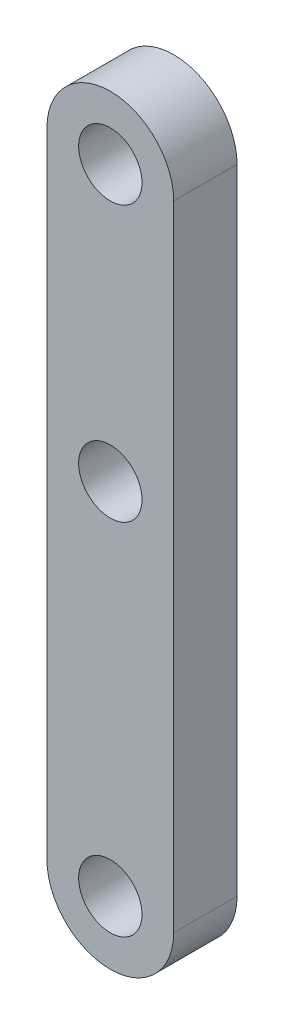
ISO-10303-21;
HEADER;
FILE_DESCRIPTION(('STEP AP214'),'2;1');
FILE_NAME('part.step','',(''),(''),'','','');
FILE_SCHEMA(('AUTOMOTIVE_DESIGN { 1 0 10303 214 1 1 1 1 }'));
ENDSEC;
DATA;
#1=APPLICATION_CONTEXT('core data for automotive mechanical design processes');
#2=APPLICATION_PROTOCOL_DEFINITION('international standard','automotive_design',2000,#1);
#3=PRODUCT_CONTEXT('',#1,'mechanical');
#4=PRODUCT('Part','Part','',(#3));
#5=PRODUCT_RELATED_PRODUCT_CATEGORY('part','',(#4));
#6=PRODUCT_DEFINITION_FORMATION('','',#4);
#7=PRODUCT_DEFINITION_CONTEXT('part definition',#1,'design');
#8=PRODUCT_DEFINITION('design','',#6,#7);
#9=PRODUCT_DEFINITION_SHAPE('','',#8);
#10=(LENGTH_UNIT() NAMED_UNIT(*) SI_UNIT(.MILLI.,.METRE.));
#11=(NAMED_UNIT(*) PLANE_ANGLE_UNIT() SI_UNIT($,.RADIAN.));
#12=(NAMED_UNIT(*) SI_UNIT($,.STERADIAN.) SOLID_ANGLE_UNIT());
#13=UNCERTAINTY_MEASURE_WITH_UNIT(LENGTH_MEASURE(1.E-05),#10,'distance_accuracy_value','');
#14=(GEOMETRIC_REPRESENTATION_CONTEXT(3) GLOBAL_UNCERTAINTY_ASSIGNED_CONTEXT((#13)) GLOBAL_UNIT_ASSIGNED_CONTEXT((#10,
#11,#12)) REPRESENTATION_CONTEXT('',''));
#15=CARTESIAN_POINT('',(0.,0.,0.));
#16=DIRECTION('',(0.,0.,1.));
#17=DIRECTION('',(1.,0.,0.));
#18=AXIS2_PLACEMENT_3D('',#15,#16,#17);
#19=CARTESIAN_POINT('',(0.,0.,3.));
#20=DIRECTION('',(0.,0.,1.));
#21=DIRECTION('',(1.,0.,0.));
#22=AXIS2_PLACEMENT_3D('',#19,#20,#21);
#23=PLANE('',#22);
#24=CARTESIAN_POINT('',(0.,-30.,3.));
#25=DIRECTION('',(0.,0.,1.));
#26=DIRECTION('',(-1.,0.,0.));
#27=AXIS2_PLACEMENT_3D('',#24,#25,#26);
#28=CIRCLE('',#27,1.5);
#29=CARTESIAN_POINT('',(-1.5,-30.,3.));
#30=VERTEX_POINT('',#29);
#31=EDGE_CURVE('E114',#30,#30,#28,.T.);
#32=ORIENTED_EDGE('',*,*,#31,.F.);
#33=EDGE_LOOP('',(#32));
#34=FACE_BOUND('',#33,.T.);
#35=CARTESIAN_POINT('',(0.,0.,3.));
#36=DIRECTION('',(0.,0.,1.));
#37=DIRECTION('',(1.,0.,0.));
#38=AXIS2_PLACEMENT_3D('',#35,#36,#37);
#39=CIRCLE('',#38,3.);
#40=CARTESIAN_POINT('',(3.,0.,3.));
#41=VERTEX_POINT('',#40);
#42=CARTESIAN_POINT('',(-3.,0.,3.));
#43=VERTEX_POINT('',#42);
#44=EDGE_CURVE('E84',#41,#43,#39,.T.);
#45=ORIENTED_EDGE('',*,*,#44,.T.);
#46=DIRECTION('',(0.,-1.,0.));
#47=VECTOR('',#46,1.);
#48=CARTESIAN_POINT('',(-3.,0.,3.));
#49=LINE('',#48,#47);
#50=CARTESIAN_POINT('',(-3.,-30.,3.));
#51=VERTEX_POINT('',#50);
#52=EDGE_CURVE('E79',#43,#51,#49,.T.);
#53=ORIENTED_EDGE('',*,*,#52,.T.);
#54=CARTESIAN_POINT('',(0.,-30.,3.));
#55=DIRECTION('',(0.,0.,1.));
#56=DIRECTION('',(-1.,0.,0.));
#57=AXIS2_PLACEMENT_3D('',#54,#55,#56);
#58=CIRCLE('',#57,3.);
#59=CARTESIAN_POINT('',(3.,-30.,3.));
#60=VERTEX_POINT('',#59);
#61=EDGE_CURVE('E82',#51,#60,#58,.T.);
#62=ORIENTED_EDGE('',*,*,#61,.T.);
#63=DIRECTION('',(0.,1.,0.));
#64=VECTOR('',#63,1.);
#65=CARTESIAN_POINT('',(3.,0.,3.));
#66=LINE('',#65,#64);
#67=EDGE_CURVE('E49',#60,#41,#66,.T.);
#68=ORIENTED_EDGE('',*,*,#67,.T.);
#69=EDGE_LOOP('',(#45,#53,#62,#68));
#70=FACE_BOUND('',#69,.T.);
#71=CARTESIAN_POINT('',(0.,0.,3.));
#72=DIRECTION('',(0.,0.,1.));
#73=DIRECTION('',(1.,0.,0.));
#74=AXIS2_PLACEMENT_3D('',#71,#72,#73);
#75=CIRCLE('',#74,1.5);
#76=CARTESIAN_POINT('',(1.5,0.,3.));
#77=VERTEX_POINT('',#76);
#78=EDGE_CURVE('E99',#77,#77,#75,.T.);
#79=ORIENTED_EDGE('',*,*,#78,.F.);
#80=EDGE_LOOP('',(#79));
#81=FACE_BOUND('',#80,.T.);
#82=CARTESIAN_POINT('',(0.,-13.,3.));
#83=DIRECTION('',(0.,0.,1.));
#84=DIRECTION('',(1.,0.,0.));
#85=AXIS2_PLACEMENT_3D('',#82,#83,#84);
#86=CIRCLE('',#85,1.5);
#87=CARTESIAN_POINT('',(1.5,-13.,3.));
#88=VERTEX_POINT('',#87);
#89=EDGE_CURVE('E120',#88,#88,#86,.T.);
#90=ORIENTED_EDGE('',*,*,#89,.F.);
#91=EDGE_LOOP('',(#90));
#92=FACE_BOUND('',#91,.T.);
#93=ADVANCED_FACE('F32',(#34,#70,#81,#92),#23,.T.);
#94=CARTESIAN_POINT('',(0.,0.,0.));
#95=DIRECTION('',(0.,0.,1.));
#96=DIRECTION('',(1.,0.,0.));
#97=AXIS2_PLACEMENT_3D('',#94,#95,#96);
#98=PLANE('',#97);
#99=CARTESIAN_POINT('',(0.,0.,0.));
#100=DIRECTION('',(0.,0.,1.));
#101=DIRECTION('',(1.,0.,0.));
#102=AXIS2_PLACEMENT_3D('',#99,#100,#101);
#103=CIRCLE('',#102,3.);
#104=CARTESIAN_POINT('',(3.,0.,0.));
#105=VERTEX_POINT('',#104);
#106=CARTESIAN_POINT('',(-3.,0.,0.));
#107=VERTEX_POINT('',#106);
#108=EDGE_CURVE('E96',#105,#107,#103,.T.);
#109=ORIENTED_EDGE('',*,*,#108,.F.);
#110=DIRECTION('',(0.,1.,0.));
#111=VECTOR('',#110,1.);
#112=CARTESIAN_POINT('',(3.,0.,0.));
#113=LINE('',#112,#111);
#114=CARTESIAN_POINT('',(3.,-30.,0.));
#115=VERTEX_POINT('',#114);
#116=EDGE_CURVE('E72',#115,#105,#113,.T.);
#117=ORIENTED_EDGE('',*,*,#116,.F.);
#118=CARTESIAN_POINT('',(0.,-30.,0.));
#119=DIRECTION('',(0.,0.,1.));
#120=DIRECTION('',(-1.,0.,0.));
#121=AXIS2_PLACEMENT_3D('',#118,#119,#120);
#122=CIRCLE('',#121,3.);
#123=CARTESIAN_POINT('',(-3.,-30.,0.));
#124=VERTEX_POINT('',#123);
#125=EDGE_CURVE('E66',#124,#115,#122,.T.);
#126=ORIENTED_EDGE('',*,*,#125,.F.);
#127=DIRECTION('',(0.,-1.,0.));
#128=VECTOR('',#127,1.);
#129=CARTESIAN_POINT('',(-3.,0.,0.));
#130=LINE('',#129,#128);
#131=EDGE_CURVE('E88',#107,#124,#130,.T.);
#132=ORIENTED_EDGE('',*,*,#131,.F.);
#133=EDGE_LOOP('',(#109,#117,#126,#132));
#134=FACE_BOUND('',#133,.T.);
#135=CARTESIAN_POINT('',(0.,0.,0.));
#136=DIRECTION('',(0.,0.,1.));
#137=DIRECTION('',(1.,0.,0.));
#138=AXIS2_PLACEMENT_3D('',#135,#136,#137);
#139=CIRCLE('',#138,1.5);
#140=CARTESIAN_POINT('',(1.5,0.,0.));
#141=VERTEX_POINT('',#140);
#142=EDGE_CURVE('E111',#141,#141,#139,.T.);
#143=ORIENTED_EDGE('',*,*,#142,.T.);
#144=EDGE_LOOP('',(#143));
#145=FACE_BOUND('',#144,.T.);
#146=CARTESIAN_POINT('',(0.,-30.,0.));
#147=DIRECTION('',(0.,0.,1.));
#148=DIRECTION('',(-1.,0.,0.));
#149=AXIS2_PLACEMENT_3D('',#146,#147,#148);
#150=CIRCLE('',#149,1.5);
#151=CARTESIAN_POINT('',(-1.5,-30.,0.));
#152=VERTEX_POINT('',#151);
#153=EDGE_CURVE('E117',#152,#152,#150,.T.);
#154=ORIENTED_EDGE('',*,*,#153,.T.);
#155=EDGE_LOOP('',(#154));
#156=FACE_BOUND('',#155,.T.);
#157=CARTESIAN_POINT('',(0.,-13.,0.));
#158=DIRECTION('',(0.,0.,1.));
#159=DIRECTION('',(1.,0.,0.));
#160=AXIS2_PLACEMENT_3D('',#157,#158,#159);
#161=CIRCLE('',#160,1.5);
#162=CARTESIAN_POINT('',(1.5,-13.,0.));
#163=VERTEX_POINT('',#162);
#164=EDGE_CURVE('E123',#163,#163,#161,.T.);
#165=ORIENTED_EDGE('',*,*,#164,.T.);
#166=EDGE_LOOP('',(#165));
#167=FACE_BOUND('',#166,.T.);
#168=ADVANCED_FACE('F107',(#134,#145,#156,#167),#98,.F.);
#169=CARTESIAN_POINT('',(0.,0.,3.));
#170=DIRECTION('',(0.,0.,-1.));
#171=DIRECTION('',(-1.,0.,0.));
#172=AXIS2_PLACEMENT_3D('',#169,#170,#171);
#173=CYLINDRICAL_SURFACE('',#172,3.);
#174=ORIENTED_EDGE('',*,*,#108,.T.);
#175=DIRECTION('',(0.,0.,-1.));
#176=VECTOR('',#175,1.);
#177=CARTESIAN_POINT('',(-3.,0.,3.));
#178=LINE('',#177,#176);
#179=EDGE_CURVE('E11',#43,#107,#178,.T.);
#180=ORIENTED_EDGE('',*,*,#179,.F.);
#181=ORIENTED_EDGE('',*,*,#44,.F.);
#182=DIRECTION('',(0.,0.,-1.));
#183=VECTOR('',#182,1.);
#184=CARTESIAN_POINT('',(3.,0.,3.));
#185=LINE('',#184,#183);
#186=EDGE_CURVE('E92',#41,#105,#185,.T.);
#187=ORIENTED_EDGE('',*,*,#186,.T.);
#188=EDGE_LOOP('',(#174,#180,#181,#187));
#189=FACE_BOUND('',#188,.T.);
#190=ADVANCED_FACE('F34',(#189),#173,.T.);
#191=CARTESIAN_POINT('',(-3.,0.,3.));
#192=DIRECTION('',(1.,0.,0.));
#193=DIRECTION('',(0.,1.,0.));
#194=AXIS2_PLACEMENT_3D('',#191,#192,#193);
#195=PLANE('',#194);
#196=ORIENTED_EDGE('',*,*,#131,.T.);
#197=DIRECTION('',(0.,0.,-1.));
#198=VECTOR('',#197,1.);
#199=CARTESIAN_POINT('',(-3.,-30.,3.));
#200=LINE('',#199,#198);
#201=EDGE_CURVE('E41',#51,#124,#200,.T.);
#202=ORIENTED_EDGE('',*,*,#201,.F.);
#203=ORIENTED_EDGE('',*,*,#52,.F.);
#204=ORIENTED_EDGE('',*,*,#179,.T.);
#205=EDGE_LOOP('',(#196,#202,#203,#204));
#206=FACE_BOUND('',#205,.T.);
#207=ADVANCED_FACE('F87',(#206),#195,.F.);
#208=CARTESIAN_POINT('',(0.,-30.,3.));
#209=DIRECTION('',(0.,0.,-1.));
#210=DIRECTION('',(-1.,0.,0.));
#211=AXIS2_PLACEMENT_3D('',#208,#209,#210);
#212=CYLINDRICAL_SURFACE('',#211,3.);
#213=ORIENTED_EDGE('',*,*,#125,.T.);
#214=DIRECTION('',(0.,0.,-1.));
#215=VECTOR('',#214,1.);
#216=CARTESIAN_POINT('',(3.,-30.,3.));
#217=LINE('',#216,#215);
#218=EDGE_CURVE('E89',#60,#115,#217,.T.);
#219=ORIENTED_EDGE('',*,*,#218,.F.);
#220=ORIENTED_EDGE('',*,*,#61,.F.);
#221=ORIENTED_EDGE('',*,*,#201,.T.);
#222=EDGE_LOOP('',(#213,#219,#220,#221));
#223=FACE_BOUND('',#222,.T.);
#224=ADVANCED_FACE('F90',(#223),#212,.T.);
#225=CARTESIAN_POINT('',(3.,0.,3.));
#226=DIRECTION('',(-1.,0.,0.));
#227=DIRECTION('',(0.,-1.,0.));
#228=AXIS2_PLACEMENT_3D('',#225,#226,#227);
#229=PLANE('',#228);
#230=ORIENTED_EDGE('',*,*,#116,.T.);
#231=ORIENTED_EDGE('',*,*,#186,.F.);
#232=ORIENTED_EDGE('',*,*,#67,.F.);
#233=ORIENTED_EDGE('',*,*,#218,.T.);
#234=EDGE_LOOP('',(#230,#231,#232,#233));
#235=FACE_BOUND('',#234,.T.);
#236=ADVANCED_FACE('F104',(#235),#229,.F.);
#237=CARTESIAN_POINT('',(0.,0.,3.));
#238=DIRECTION('',(0.,0.,-1.));
#239=DIRECTION('',(-1.,0.,0.));
#240=AXIS2_PLACEMENT_3D('',#237,#238,#239);
#241=CYLINDRICAL_SURFACE('',#240,1.5);
#242=ORIENTED_EDGE('',*,*,#78,.T.);
#243=EDGE_LOOP('',(#242));
#244=FACE_BOUND('',#243,.T.);
#245=ORIENTED_EDGE('',*,*,#142,.F.);
#246=EDGE_LOOP('',(#245));
#247=FACE_BOUND('',#246,.T.);
#248=ADVANCED_FACE('F141',(#244,#247),#241,.F.);
#249=CARTESIAN_POINT('',(0.,-30.,3.));
#250=DIRECTION('',(0.,0.,-1.));
#251=DIRECTION('',(-1.,0.,0.));
#252=AXIS2_PLACEMENT_3D('',#249,#250,#251);
#253=CYLINDRICAL_SURFACE('',#252,1.5);
#254=ORIENTED_EDGE('',*,*,#31,.T.);
#255=EDGE_LOOP('',(#254));
#256=FACE_BOUND('',#255,.T.);
#257=ORIENTED_EDGE('',*,*,#153,.F.);
#258=EDGE_LOOP('',(#257));
#259=FACE_BOUND('',#258,.T.);
#260=ADVANCED_FACE('F187',(#256,#259),#253,.F.);
#261=CARTESIAN_POINT('',(0.,-13.,3.));
#262=DIRECTION('',(0.,0.,-1.));
#263=DIRECTION('',(-1.,0.,0.));
#264=AXIS2_PLACEMENT_3D('',#261,#262,#263);
#265=CYLINDRICAL_SURFACE('',#264,1.5);
#266=ORIENTED_EDGE('',*,*,#89,.T.);
#267=EDGE_LOOP('',(#266));
#268=FACE_BOUND('',#267,.T.);
#269=ORIENTED_EDGE('',*,*,#164,.F.);
#270=EDGE_LOOP('',(#269));
#271=FACE_BOUND('',#270,.T.);
#272=ADVANCED_FACE('F129',(#268,#271),#265,.F.);
#273=CLOSED_SHELL('',(#93,#168,#190,#207,#224,#236,#248,#260,#272));
#274=MANIFOLD_SOLID_BREP('B2',#273);
#275=ADVANCED_BREP_SHAPE_REPRESENTATION('',(#18,#274),#14);
#276=SHAPE_DEFINITION_REPRESENTATION(#9,#275);
ENDSEC;
END-ISO-10303-21;
